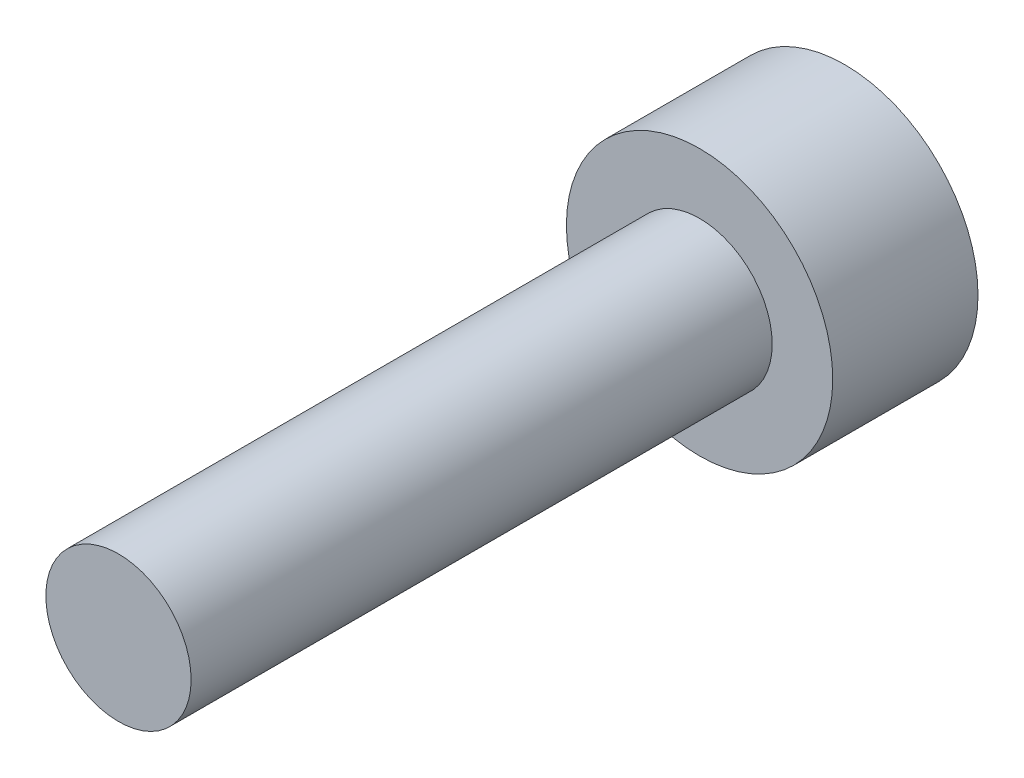
ISO-10303-21;
HEADER;
FILE_DESCRIPTION(('STEP AP214'),'2;1');
FILE_NAME('part.step','',(''),(''),'','','');
FILE_SCHEMA(('AUTOMOTIVE_DESIGN { 1 0 10303 214 1 1 1 1 }'));
ENDSEC;
DATA;
#1=APPLICATION_CONTEXT('core data for automotive mechanical design processes');
#2=APPLICATION_PROTOCOL_DEFINITION('international standard','automotive_design',2000,#1);
#3=PRODUCT_CONTEXT('',#1,'mechanical');
#4=PRODUCT('Part','Part','',(#3));
#5=PRODUCT_RELATED_PRODUCT_CATEGORY('part','',(#4));
#6=PRODUCT_DEFINITION_FORMATION('','',#4);
#7=PRODUCT_DEFINITION_CONTEXT('part definition',#1,'design');
#8=PRODUCT_DEFINITION('design','',#6,#7);
#9=PRODUCT_DEFINITION_SHAPE('','',#8);
#10=(LENGTH_UNIT() NAMED_UNIT(*) SI_UNIT(.MILLI.,.METRE.));
#11=(NAMED_UNIT(*) PLANE_ANGLE_UNIT() SI_UNIT($,.RADIAN.));
#12=(NAMED_UNIT(*) SI_UNIT($,.STERADIAN.) SOLID_ANGLE_UNIT());
#13=UNCERTAINTY_MEASURE_WITH_UNIT(LENGTH_MEASURE(1.E-05),#10,'distance_accuracy_value','');
#14=(GEOMETRIC_REPRESENTATION_CONTEXT(3) GLOBAL_UNCERTAINTY_ASSIGNED_CONTEXT((#13)) GLOBAL_UNIT_ASSIGNED_CONTEXT((#10,
#11,#12)) REPRESENTATION_CONTEXT('',''));
#15=CARTESIAN_POINT('',(0.,0.,0.));
#16=DIRECTION('',(0.,0.,1.));
#17=DIRECTION('',(1.,0.,0.));
#18=AXIS2_PLACEMENT_3D('',#15,#16,#17);
#19=CARTESIAN_POINT('',(0.,0.,3.));
#20=DIRECTION('',(0.,0.,1.));
#21=DIRECTION('',(1.,0.,0.));
#22=AXIS2_PLACEMENT_3D('',#19,#20,#21);
#23=PLANE('',#22);
#24=CARTESIAN_POINT('',(0.,0.,3.));
#25=DIRECTION('',(0.,0.,1.));
#26=DIRECTION('',(1.,0.,0.));
#27=AXIS2_PLACEMENT_3D('',#24,#25,#26);
#28=CIRCLE('',#27,2.75);
#29=CARTESIAN_POINT('',(2.75,0.,3.));
#30=VERTEX_POINT('',#29);
#31=EDGE_CURVE('E11',#30,#30,#28,.T.);
#32=ORIENTED_EDGE('',*,*,#31,.T.);
#33=EDGE_LOOP('',(#32));
#34=FACE_BOUND('',#33,.T.);
#35=CARTESIAN_POINT('',(0.,0.,3.));
#36=DIRECTION('',(0.,0.,1.));
#37=DIRECTION('',(1.,0.,0.));
#38=AXIS2_PLACEMENT_3D('',#35,#36,#37);
#39=CIRCLE('',#38,1.5);
#40=CARTESIAN_POINT('',(1.5,0.,3.));
#41=VERTEX_POINT('',#40);
#42=EDGE_CURVE('E139',#41,#41,#39,.T.);
#43=ORIENTED_EDGE('',*,*,#42,.F.);
#44=EDGE_LOOP('',(#43));
#45=FACE_BOUND('',#44,.T.);
#46=ADVANCED_FACE('F37',(#34,#45),#23,.T.);
#47=CARTESIAN_POINT('',(0.,0.,3.));
#48=DIRECTION('',(0.,0.,-1.));
#49=DIRECTION('',(-1.,0.,0.));
#50=AXIS2_PLACEMENT_3D('',#47,#48,#49);
#51=CYLINDRICAL_SURFACE('',#50,2.75);
#52=ORIENTED_EDGE('',*,*,#31,.F.);
#53=EDGE_LOOP('',(#52));
#54=FACE_BOUND('',#53,.T.);
#55=CARTESIAN_POINT('',(0.,0.,0.));
#56=DIRECTION('',(0.,0.,1.));
#57=DIRECTION('',(1.,0.,0.));
#58=AXIS2_PLACEMENT_3D('',#55,#56,#57);
#59=CIRCLE('',#58,2.75);
#60=CARTESIAN_POINT('',(2.75,0.,0.));
#61=VERTEX_POINT('',#60);
#62=EDGE_CURVE('E41',#61,#61,#59,.T.);
#63=ORIENTED_EDGE('',*,*,#62,.T.);
#64=EDGE_LOOP('',(#63));
#65=FACE_BOUND('',#64,.T.);
#66=ADVANCED_FACE('F39',(#54,#65),#51,.T.);
#67=CARTESIAN_POINT('',(0.,0.,0.));
#68=DIRECTION('',(0.,0.,1.));
#69=DIRECTION('',(1.,0.,0.));
#70=AXIS2_PLACEMENT_3D('',#67,#68,#69);
#71=PLANE('',#70);
#72=DIRECTION('',(0.284171427874139,0.958773487107342,0.));
#73=VECTOR('',#72,1.);
#74=CARTESIAN_POINT('',(-1.66357981000848,-0.399103763087742,0.));
#75=LINE('',#74,#73);
#76=CARTESIAN_POINT('',(-1.66357981000848,-0.399103763087742,0.));
#77=VERTEX_POINT('',#76);
#78=CARTESIAN_POINT('',(-1.17742390258419,1.24115049514637,0.));
#79=VERTEX_POINT('',#78);
#80=EDGE_CURVE('E126',#77,#79,#75,.T.);
#81=ORIENTED_EDGE('',*,*,#80,.F.);
#82=DIRECTION('',(-0.688236482372881,0.725486419122372,0.));
#83=VECTOR('',#82,1.);
#84=CARTESIAN_POINT('',(-0.48615590742429,-1.64025425823411,0.));
#85=LINE('',#84,#83);
#86=CARTESIAN_POINT('',(-0.48615590742429,-1.64025425823411,0.));
#87=VERTEX_POINT('',#86);
#88=EDGE_CURVE('E52',#87,#77,#85,.T.);
#89=ORIENTED_EDGE('',*,*,#88,.F.);
#90=DIRECTION('',(-0.97240791024702,-0.23328706798497,0.));
#91=VECTOR('',#90,1.);
#92=CARTESIAN_POINT('',(1.17742390258419,-1.24115049514637,0.));
#93=LINE('',#92,#91);
#94=CARTESIAN_POINT('',(1.17742390258419,-1.24115049514637,0.));
#95=VERTEX_POINT('',#94);
#96=EDGE_CURVE('E135',#95,#87,#93,.T.);
#97=ORIENTED_EDGE('',*,*,#96,.F.);
#98=DIRECTION('',(-0.284171427874138,-0.958773487107342,0.));
#99=VECTOR('',#98,1.);
#100=CARTESIAN_POINT('',(1.66357981000848,0.399103763087743,0.));
#101=LINE('',#100,#99);
#102=CARTESIAN_POINT('',(1.66357981000848,0.399103763087743,0.));
#103=VERTEX_POINT('',#102);
#104=EDGE_CURVE('E133',#103,#95,#101,.T.);
#105=ORIENTED_EDGE('',*,*,#104,.F.);
#106=DIRECTION('',(0.688236482372881,-0.725486419122372,0.));
#107=VECTOR('',#106,1.);
#108=CARTESIAN_POINT('',(0.486155907424292,1.64025425823411,0.));
#109=LINE('',#108,#107);
#110=CARTESIAN_POINT('',(0.486155907424292,1.64025425823411,0.));
#111=VERTEX_POINT('',#110);
#112=EDGE_CURVE('E100',#111,#103,#109,.T.);
#113=ORIENTED_EDGE('',*,*,#112,.F.);
#114=DIRECTION('',(0.97240791024702,0.23328706798497,0.));
#115=VECTOR('',#114,1.);
#116=CARTESIAN_POINT('',(-1.17742390258419,1.24115049514637,0.));
#117=LINE('',#116,#115);
#118=EDGE_CURVE('E129',#79,#111,#117,.T.);
#119=ORIENTED_EDGE('',*,*,#118,.F.);
#120=EDGE_LOOP('',(#81,#89,#97,#105,#113,#119));
#121=FACE_BOUND('',#120,.T.);
#122=ORIENTED_EDGE('',*,*,#62,.F.);
#123=EDGE_LOOP('',(#122));
#124=FACE_BOUND('',#123,.T.);
#125=ADVANCED_FACE('F159',(#121,#124),#71,.F.);
#126=CARTESIAN_POINT('',(0.,0.,15.));
#127=DIRECTION('',(0.,0.,-1.));
#128=DIRECTION('',(-1.,0.,0.));
#129=AXIS2_PLACEMENT_3D('',#126,#127,#128);
#130=CYLINDRICAL_SURFACE('',#129,1.5);
#131=CARTESIAN_POINT('',(0.,0.,15.));
#132=DIRECTION('',(0.,0.,1.));
#133=DIRECTION('',(1.,0.,0.));
#134=AXIS2_PLACEMENT_3D('',#131,#132,#133);
#135=CIRCLE('',#134,1.5);
#136=CARTESIAN_POINT('',(1.5,0.,15.));
#137=VERTEX_POINT('',#136);
#138=EDGE_CURVE('E145',#137,#137,#135,.T.);
#139=ORIENTED_EDGE('',*,*,#138,.F.);
#140=EDGE_LOOP('',(#139));
#141=FACE_BOUND('',#140,.T.);
#142=ORIENTED_EDGE('',*,*,#42,.T.);
#143=EDGE_LOOP('',(#142));
#144=FACE_BOUND('',#143,.T.);
#145=ADVANCED_FACE('F151',(#141,#144),#130,.T.);
#146=CARTESIAN_POINT('',(0.,0.,15.));
#147=DIRECTION('',(0.,0.,1.));
#148=DIRECTION('',(1.,0.,0.));
#149=AXIS2_PLACEMENT_3D('',#146,#147,#148);
#150=PLANE('',#149);
#151=ORIENTED_EDGE('',*,*,#138,.T.);
#152=EDGE_LOOP('',(#151));
#153=FACE_BOUND('',#152,.T.);
#154=ADVANCED_FACE('F168',(#153),#150,.T.);
#155=CARTESIAN_POINT('',(-0.48615590742429,-1.64025425823411,2.));
#156=DIRECTION('',(-0.725486419122372,-0.688236482372881,0.));
#157=DIRECTION('',(0.688236482372881,-0.725486419122372,0.));
#158=AXIS2_PLACEMENT_3D('',#155,#156,#157);
#159=PLANE('',#158);
#160=ORIENTED_EDGE('',*,*,#88,.T.);
#161=DIRECTION('',(0.,0.,-1.));
#162=VECTOR('',#161,1.);
#163=CARTESIAN_POINT('',(-1.66357981000848,-0.399103763087742,2.));
#164=LINE('',#163,#162);
#165=CARTESIAN_POINT('',(-1.66357981000848,-0.399103763087742,2.));
#166=VERTEX_POINT('',#165);
#167=EDGE_CURVE('E82',#166,#77,#164,.T.);
#168=ORIENTED_EDGE('',*,*,#167,.F.);
#169=DIRECTION('',(-0.688236482372881,0.725486419122372,0.));
#170=VECTOR('',#169,1.);
#171=CARTESIAN_POINT('',(-0.48615590742429,-1.64025425823411,2.));
#172=LINE('',#171,#170);
#173=CARTESIAN_POINT('',(-0.48615590742429,-1.64025425823411,2.));
#174=VERTEX_POINT('',#173);
#175=EDGE_CURVE('E137',#174,#166,#172,.T.);
#176=ORIENTED_EDGE('',*,*,#175,.F.);
#177=DIRECTION('',(0.,0.,-1.));
#178=VECTOR('',#177,1.);
#179=CARTESIAN_POINT('',(-0.48615590742429,-1.64025425823411,2.));
#180=LINE('',#179,#178);
#181=EDGE_CURVE('E60',#174,#87,#180,.T.);
#182=ORIENTED_EDGE('',*,*,#181,.T.);
#183=EDGE_LOOP('',(#160,#168,#176,#182));
#184=FACE_BOUND('',#183,.T.);
#185=ADVANCED_FACE('F180',(#184),#159,.F.);
#186=CARTESIAN_POINT('',(1.17742390258419,-1.24115049514637,2.));
#187=DIRECTION('',(0.23328706798497,-0.97240791024702,0.));
#188=DIRECTION('',(0.97240791024702,0.23328706798497,0.));
#189=AXIS2_PLACEMENT_3D('',#186,#187,#188);
#190=PLANE('',#189);
#191=ORIENTED_EDGE('',*,*,#96,.T.);
#192=ORIENTED_EDGE('',*,*,#181,.F.);
#193=DIRECTION('',(-0.97240791024702,-0.23328706798497,0.));
#194=VECTOR('',#193,1.);
#195=CARTESIAN_POINT('',(1.17742390258419,-1.24115049514637,2.));
#196=LINE('',#195,#194);
#197=CARTESIAN_POINT('',(1.17742390258419,-1.24115049514637,2.));
#198=VERTEX_POINT('',#197);
#199=EDGE_CURVE('E112',#198,#174,#196,.T.);
#200=ORIENTED_EDGE('',*,*,#199,.F.);
#201=DIRECTION('',(0.,0.,-1.));
#202=VECTOR('',#201,1.);
#203=CARTESIAN_POINT('',(1.17742390258419,-1.24115049514637,2.));
#204=LINE('',#203,#202);
#205=EDGE_CURVE('E104',#198,#95,#204,.T.);
#206=ORIENTED_EDGE('',*,*,#205,.T.);
#207=EDGE_LOOP('',(#191,#192,#200,#206));
#208=FACE_BOUND('',#207,.T.);
#209=ADVANCED_FACE('F182',(#208),#190,.F.);
#210=CARTESIAN_POINT('',(1.66357981000848,0.399103763087743,2.));
#211=DIRECTION('',(0.958773487107343,-0.284171427874138,0.));
#212=DIRECTION('',(0.284171427874138,0.958773487107343,0.));
#213=AXIS2_PLACEMENT_3D('',#210,#211,#212);
#214=PLANE('',#213);
#215=ORIENTED_EDGE('',*,*,#104,.T.);
#216=ORIENTED_EDGE('',*,*,#205,.F.);
#217=DIRECTION('',(-0.284171427874138,-0.958773487107342,0.));
#218=VECTOR('',#217,1.);
#219=CARTESIAN_POINT('',(1.66357981000848,0.399103763087743,2.));
#220=LINE('',#219,#218);
#221=CARTESIAN_POINT('',(1.66357981000848,0.399103763087743,2.));
#222=VERTEX_POINT('',#221);
#223=EDGE_CURVE('E108',#222,#198,#220,.T.);
#224=ORIENTED_EDGE('',*,*,#223,.F.);
#225=DIRECTION('',(0.,0.,-1.));
#226=VECTOR('',#225,1.);
#227=CARTESIAN_POINT('',(1.66357981000848,0.399103763087743,2.));
#228=LINE('',#227,#226);
#229=EDGE_CURVE('E93',#222,#103,#228,.T.);
#230=ORIENTED_EDGE('',*,*,#229,.T.);
#231=EDGE_LOOP('',(#215,#216,#224,#230));
#232=FACE_BOUND('',#231,.T.);
#233=ADVANCED_FACE('F109',(#232),#214,.F.);
#234=CARTESIAN_POINT('',(0.486155907424292,1.64025425823411,2.));
#235=DIRECTION('',(0.725486419122372,0.688236482372881,0.));
#236=DIRECTION('',(-0.688236482372881,0.725486419122372,0.));
#237=AXIS2_PLACEMENT_3D('',#234,#235,#236);
#238=PLANE('',#237);
#239=ORIENTED_EDGE('',*,*,#112,.T.);
#240=ORIENTED_EDGE('',*,*,#229,.F.);
#241=DIRECTION('',(0.688236482372881,-0.725486419122372,0.));
#242=VECTOR('',#241,1.);
#243=CARTESIAN_POINT('',(0.486155907424292,1.64025425823411,2.));
#244=LINE('',#243,#242);
#245=CARTESIAN_POINT('',(0.486155907424292,1.64025425823411,2.));
#246=VERTEX_POINT('',#245);
#247=EDGE_CURVE('E97',#246,#222,#244,.T.);
#248=ORIENTED_EDGE('',*,*,#247,.F.);
#249=DIRECTION('',(0.,0.,-1.));
#250=VECTOR('',#249,1.);
#251=CARTESIAN_POINT('',(0.486155907424292,1.64025425823411,2.));
#252=LINE('',#251,#250);
#253=EDGE_CURVE('E105',#246,#111,#252,.T.);
#254=ORIENTED_EDGE('',*,*,#253,.T.);
#255=EDGE_LOOP('',(#239,#240,#248,#254));
#256=FACE_BOUND('',#255,.T.);
#257=ADVANCED_FACE('F95',(#256),#238,.F.);
#258=CARTESIAN_POINT('',(-1.17742390258419,1.24115049514637,2.));
#259=DIRECTION('',(-0.23328706798497,0.97240791024702,0.));
#260=DIRECTION('',(-0.97240791024702,-0.23328706798497,0.));
#261=AXIS2_PLACEMENT_3D('',#258,#259,#260);
#262=PLANE('',#261);
#263=ORIENTED_EDGE('',*,*,#118,.T.);
#264=ORIENTED_EDGE('',*,*,#253,.F.);
#265=DIRECTION('',(0.97240791024702,0.23328706798497,0.));
#266=VECTOR('',#265,1.);
#267=CARTESIAN_POINT('',(-1.17742390258419,1.24115049514637,2.));
#268=LINE('',#267,#266);
#269=CARTESIAN_POINT('',(-1.17742390258419,1.24115049514637,2.));
#270=VERTEX_POINT('',#269);
#271=EDGE_CURVE('E118',#270,#246,#268,.T.);
#272=ORIENTED_EDGE('',*,*,#271,.F.);
#273=DIRECTION('',(0.,0.,-1.));
#274=VECTOR('',#273,1.);
#275=CARTESIAN_POINT('',(-1.17742390258419,1.24115049514637,2.));
#276=LINE('',#275,#274);
#277=EDGE_CURVE('E142',#270,#79,#276,.T.);
#278=ORIENTED_EDGE('',*,*,#277,.T.);
#279=EDGE_LOOP('',(#263,#264,#272,#278));
#280=FACE_BOUND('',#279,.T.);
#281=ADVANCED_FACE('F193',(#280),#262,.F.);
#282=CARTESIAN_POINT('',(-1.66357981000848,-0.399103763087742,2.));
#283=DIRECTION('',(-0.958773487107342,0.284171427874139,0.));
#284=DIRECTION('',(-0.284171427874139,-0.958773487107342,0.));
#285=AXIS2_PLACEMENT_3D('',#282,#283,#284);
#286=PLANE('',#285);
#287=ORIENTED_EDGE('',*,*,#80,.T.);
#288=ORIENTED_EDGE('',*,*,#277,.F.);
#289=DIRECTION('',(0.284171427874139,0.958773487107342,0.));
#290=VECTOR('',#289,1.);
#291=CARTESIAN_POINT('',(-1.66357981000848,-0.399103763087742,2.));
#292=LINE('',#291,#290);
#293=EDGE_CURVE('E120',#166,#270,#292,.T.);
#294=ORIENTED_EDGE('',*,*,#293,.F.);
#295=ORIENTED_EDGE('',*,*,#167,.T.);
#296=EDGE_LOOP('',(#287,#288,#294,#295));
#297=FACE_BOUND('',#296,.T.);
#298=ADVANCED_FACE('F178',(#297),#286,.F.);
#299=CARTESIAN_POINT('',(0.,0.,2.));
#300=DIRECTION('',(0.,0.,-1.));
#301=DIRECTION('',(-1.,0.,0.));
#302=AXIS2_PLACEMENT_3D('',#299,#300,#301);
#303=PLANE('',#302);
#304=ORIENTED_EDGE('',*,*,#175,.T.);
#305=ORIENTED_EDGE('',*,*,#293,.T.);
#306=ORIENTED_EDGE('',*,*,#271,.T.);
#307=ORIENTED_EDGE('',*,*,#247,.T.);
#308=ORIENTED_EDGE('',*,*,#223,.T.);
#309=ORIENTED_EDGE('',*,*,#199,.T.);
#310=EDGE_LOOP('',(#304,#305,#306,#307,#308,#309));
#311=FACE_BOUND('',#310,.T.);
#312=ADVANCED_FACE('F115',(#311),#303,.T.);
#313=CLOSED_SHELL('',(#46,#66,#125,#145,#154,#185,#209,#233,#257,#281,#298,#312));
#314=MANIFOLD_SOLID_BREP('B2',#313);
#315=ADVANCED_BREP_SHAPE_REPRESENTATION('',(#18,#314),#14);
#316=SHAPE_DEFINITION_REPRESENTATION(#9,#315);
ENDSEC;
END-ISO-10303-21;
